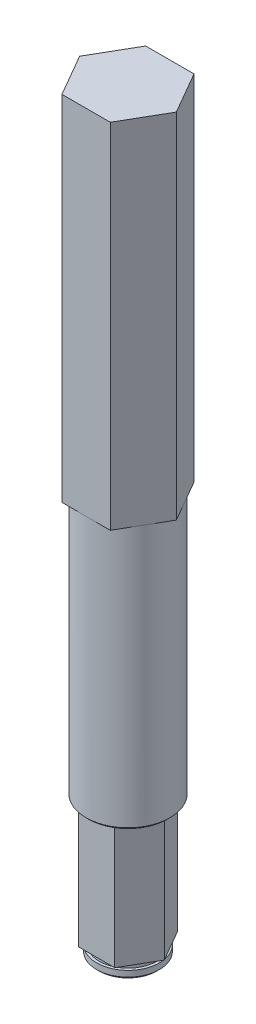
ISO-10303-21;
HEADER;
FILE_DESCRIPTION(('STEP AP214'),'2;1');
FILE_NAME('part.step','',(''),(''),'','','');
FILE_SCHEMA(('AUTOMOTIVE_DESIGN { 1 0 10303 214 1 1 1 1 }'));
ENDSEC;
DATA;
#1=APPLICATION_CONTEXT('core data for automotive mechanical design processes');
#2=APPLICATION_PROTOCOL_DEFINITION('international standard','automotive_design',2000,#1);
#3=PRODUCT_CONTEXT('',#1,'mechanical');
#4=PRODUCT('Part','Part','',(#3));
#5=PRODUCT_RELATED_PRODUCT_CATEGORY('part','',(#4));
#6=PRODUCT_DEFINITION_FORMATION('','',#4);
#7=PRODUCT_DEFINITION_CONTEXT('part definition',#1,'design');
#8=PRODUCT_DEFINITION('design','',#6,#7);
#9=PRODUCT_DEFINITION_SHAPE('','',#8);
#10=(LENGTH_UNIT() NAMED_UNIT(*) SI_UNIT(.MILLI.,.METRE.));
#11=(NAMED_UNIT(*) PLANE_ANGLE_UNIT() SI_UNIT($,.RADIAN.));
#12=(NAMED_UNIT(*) SI_UNIT($,.STERADIAN.) SOLID_ANGLE_UNIT());
#13=UNCERTAINTY_MEASURE_WITH_UNIT(LENGTH_MEASURE(1.E-05),#10,'distance_accuracy_value','');
#14=(GEOMETRIC_REPRESENTATION_CONTEXT(3) GLOBAL_UNCERTAINTY_ASSIGNED_CONTEXT((#13)) GLOBAL_UNIT_ASSIGNED_CONTEXT((#10,
#11,#12)) REPRESENTATION_CONTEXT('',''));
#15=CARTESIAN_POINT('',(0.,0.,0.));
#16=DIRECTION('',(0.,0.,1.));
#17=DIRECTION('',(1.,0.,0.));
#18=AXIS2_PLACEMENT_3D('',#15,#16,#17);
#19=CARTESIAN_POINT('',(0.,-0.6096,0.));
#20=DIRECTION('',(0.,-1.,0.));
#21=DIRECTION('',(1.,0.,0.));
#22=AXIS2_PLACEMENT_3D('',#19,#20,#21);
#23=PLANE('',#22);
#24=CARTESIAN_POINT('',(0.,-0.609600000018416,0.));
#25=DIRECTION('',(0.,1.,0.));
#26=DIRECTION('',(-1.,0.,0.));
#27=AXIS2_PLACEMENT_3D('',#24,#25,#26);
#28=CIRCLE('',#27,4.38149999990856);
#29=CARTESIAN_POINT('',(-4.38149999990856,-0.609600000018418,0.));
#30=VERTEX_POINT('',#29);
#31=EDGE_CURVE('E20',#30,#30,#28,.T.);
#32=ORIENTED_EDGE('',*,*,#31,.F.);
#33=EDGE_LOOP('',(#32));
#34=FACE_BOUND('',#33,.T.);
#35=ADVANCED_FACE('F17',(#34),#23,.T.);
#36=CARTESIAN_POINT('',(0.,-0.228600000014011,0.));
#37=DIRECTION('',(0.,1.,0.));
#38=DIRECTION('',(-1.,0.,0.));
#39=AXIS2_PLACEMENT_3D('',#36,#37,#38);
#40=CONICAL_SURFACE('',#39,4.76249999991296,0.785398163397448);
#41=ORIENTED_EDGE('',*,*,#31,.T.);
#42=EDGE_LOOP('',(#41));
#43=FACE_BOUND('',#42,.T.);
#44=CARTESIAN_POINT('',(0.,-0.228600000000001,0.));
#45=DIRECTION('',(0.,1.,0.));
#46=DIRECTION('',(-1.,0.,0.));
#47=AXIS2_PLACEMENT_3D('',#44,#45,#46);
#48=CIRCLE('',#47,4.7625);
#49=CARTESIAN_POINT('',(-4.7625,-0.228600000000002,0.));
#50=VERTEX_POINT('',#49);
#51=EDGE_CURVE('E185',#50,#50,#48,.T.);
#52=ORIENTED_EDGE('',*,*,#51,.F.);
#53=EDGE_LOOP('',(#52));
#54=FACE_BOUND('',#53,.T.);
#55=ADVANCED_FACE('F232',(#43,#54),#40,.T.);
#56=CARTESIAN_POINT('',(0.,0.,0.));
#57=DIRECTION('',(0.,1.,0.));
#58=DIRECTION('',(-1.,0.,0.));
#59=AXIS2_PLACEMENT_3D('',#56,#57,#58);
#60=CYLINDRICAL_SURFACE('',#59,4.7625);
#61=ORIENTED_EDGE('',*,*,#51,.T.);
#62=EDGE_LOOP('',(#61));
#63=FACE_BOUND('',#62,.T.);
#64=CARTESIAN_POINT('',(0.,0.660400000000001,0.));
#65=DIRECTION('',(0.,1.,0.));
#66=DIRECTION('',(-1.,0.,0.));
#67=AXIS2_PLACEMENT_3D('',#64,#65,#66);
#68=CIRCLE('',#67,4.7625);
#69=CARTESIAN_POINT('',(-4.7625,0.6604,0.));
#70=VERTEX_POINT('',#69);
#71=EDGE_CURVE('E188',#70,#70,#68,.F.);
#72=ORIENTED_EDGE('',*,*,#71,.T.);
#73=EDGE_LOOP('',(#72));
#74=FACE_BOUND('',#73,.T.);
#75=ADVANCED_FACE('F218',(#63,#74),#60,.T.);
#76=CARTESIAN_POINT('',(0.,0.6604,5.29754654056465));
#77=DIRECTION('',(0.,-1.,0.));
#78=DIRECTION('',(0.,0.,-1.));
#79=AXIS2_PLACEMENT_3D('',#76,#77,#78);
#80=PLANE('',#79);
#81=CARTESIAN_POINT('',(0.,0.6604,0.));
#82=DIRECTION('',(0.,1.,0.));
#83=DIRECTION('',(0.,0.,1.));
#84=AXIS2_PLACEMENT_3D('',#81,#82,#83);
#85=CIRCLE('',#84,4.3561);
#86=CARTESIAN_POINT('',(0.,0.6604,4.3561));
#87=VERTEX_POINT('',#86);
#88=EDGE_CURVE('E213',#87,#87,#85,.T.);
#89=ORIENTED_EDGE('',*,*,#88,.F.);
#90=EDGE_LOOP('',(#89));
#91=FACE_BOUND('',#90,.T.);
#92=ORIENTED_EDGE('',*,*,#71,.F.);
#93=EDGE_LOOP('',(#92));
#94=FACE_BOUND('',#93,.T.);
#95=ADVANCED_FACE('F220',(#91,#94),#80,.F.);
#96=CARTESIAN_POINT('',(0.,1.0287,0.));
#97=DIRECTION('',(0.,1.,0.));
#98=DIRECTION('',(0.,0.,1.));
#99=AXIS2_PLACEMENT_3D('',#96,#97,#98);
#100=CYLINDRICAL_SURFACE('',#99,4.3561);
#101=CARTESIAN_POINT('',(0.,1.397,0.));
#102=DIRECTION('',(0.,1.,0.));
#103=DIRECTION('',(0.,0.,1.));
#104=AXIS2_PLACEMENT_3D('',#101,#102,#103);
#105=CIRCLE('',#104,4.3561);
#106=CARTESIAN_POINT('',(0.,1.397,4.3561));
#107=VERTEX_POINT('',#106);
#108=EDGE_CURVE('E141',#107,#107,#105,.F.);
#109=ORIENTED_EDGE('',*,*,#108,.T.);
#110=EDGE_LOOP('',(#109));
#111=FACE_BOUND('',#110,.T.);
#112=ORIENTED_EDGE('',*,*,#88,.T.);
#113=EDGE_LOOP('',(#112));
#114=FACE_BOUND('',#113,.T.);
#115=ADVANCED_FACE('F222',(#111,#114),#100,.T.);
#116=CARTESIAN_POINT('',(0.,1.397,5.29754654056465));
#117=DIRECTION('',(0.,1.,0.));
#118=DIRECTION('',(0.,0.,1.));
#119=AXIS2_PLACEMENT_3D('',#116,#117,#118);
#120=PLANE('',#119);
#121=ORIENTED_EDGE('',*,*,#108,.F.);
#122=EDGE_LOOP('',(#121));
#123=FACE_BOUND('',#122,.T.);
#124=DIRECTION('',(-1.,0.,0.));
#125=VECTOR('',#124,1.);
#126=CARTESIAN_POINT('',(-2.7496306570156,1.397,-4.7625));
#127=LINE('',#126,#125);
#128=CARTESIAN_POINT('',(2.7496306570156,1.397,-4.7625));
#129=VERTEX_POINT('',#128);
#130=CARTESIAN_POINT('',(-2.7496306570156,1.397,-4.7625));
#131=VERTEX_POINT('',#130);
#132=EDGE_CURVE('E537',#129,#131,#127,.T.);
#133=ORIENTED_EDGE('',*,*,#132,.F.);
#134=DIRECTION('',(-0.5,0.,-0.866025403784439));
#135=VECTOR('',#134,1.);
#136=CARTESIAN_POINT('',(2.7496306570156,1.397,-4.7625));
#137=LINE('',#136,#135);
#138=CARTESIAN_POINT('',(5.49926131403119,1.397,0.));
#139=VERTEX_POINT('',#138);
#140=EDGE_CURVE('E543',#139,#129,#137,.T.);
#141=ORIENTED_EDGE('',*,*,#140,.F.);
#142=DIRECTION('',(0.5,0.,-0.866025403784439));
#143=VECTOR('',#142,1.);
#144=CARTESIAN_POINT('',(5.49926131403119,1.397,0.));
#145=LINE('',#144,#143);
#146=CARTESIAN_POINT('',(2.7496306570156,1.397,4.7625));
#147=VERTEX_POINT('',#146);
#148=EDGE_CURVE('E125',#147,#139,#145,.T.);
#149=ORIENTED_EDGE('',*,*,#148,.F.);
#150=DIRECTION('',(1.,0.,0.));
#151=VECTOR('',#150,1.);
#152=CARTESIAN_POINT('',(0.,1.397,4.7625));
#153=LINE('',#152,#151);
#154=CARTESIAN_POINT('',(-2.7496306570156,1.397,4.7625));
#155=VERTEX_POINT('',#154);
#156=EDGE_CURVE('E122',#155,#147,#153,.T.);
#157=ORIENTED_EDGE('',*,*,#156,.F.);
#158=DIRECTION('',(0.499999999999999,0.,0.866025403784439));
#159=VECTOR('',#158,1.);
#160=CARTESIAN_POINT('',(-2.7496306570156,1.397,4.7625));
#161=LINE('',#160,#159);
#162=CARTESIAN_POINT('',(-5.49926131403119,1.397,0.));
#163=VERTEX_POINT('',#162);
#164=EDGE_CURVE('E107',#163,#155,#161,.T.);
#165=ORIENTED_EDGE('',*,*,#164,.F.);
#166=DIRECTION('',(-0.5,0.,0.866025403784438));
#167=VECTOR('',#166,1.);
#168=CARTESIAN_POINT('',(-5.49926131403119,1.397,0.));
#169=LINE('',#168,#167);
#170=EDGE_CURVE('E532',#131,#163,#169,.T.);
#171=ORIENTED_EDGE('',*,*,#170,.F.);
#172=EDGE_LOOP('',(#133,#141,#149,#157,#165,#171));
#173=FACE_BOUND('',#172,.T.);
#174=ADVANCED_FACE('F123',(#123,#173),#120,.F.);
#175=CARTESIAN_POINT('',(0.,113.6904,0.));
#176=DIRECTION('',(0.,-1.,0.));
#177=DIRECTION('',(1.,0.,0.));
#178=AXIS2_PLACEMENT_3D('',#175,#176,#177);
#179=PLANE('',#178);
#180=DIRECTION('',(-0.5,0.,0.866025403784439));
#181=VECTOR('',#180,1.);
#182=CARTESIAN_POINT('',(-3.66617420935416,113.6904,-6.35));
#183=LINE('',#182,#181);
#184=CARTESIAN_POINT('',(-7.33234841870828,113.6904,0.));
#185=VERTEX_POINT('',#184);
#186=CARTESIAN_POINT('',(-3.66617420935414,113.6904,-6.35));
#187=VERTEX_POINT('',#186);
#188=EDGE_CURVE('E152',#185,#187,#183,.F.);
#189=ORIENTED_EDGE('',*,*,#188,.F.);
#190=DIRECTION('',(0.5,0.,0.866025403784438));
#191=VECTOR('',#190,1.);
#192=CARTESIAN_POINT('',(-7.33234841870827,113.6904,0.));
#193=LINE('',#192,#191);
#194=CARTESIAN_POINT('',(-3.66617420935415,113.6904,6.35));
#195=VERTEX_POINT('',#194);
#196=EDGE_CURVE('E176',#195,#185,#193,.F.);
#197=ORIENTED_EDGE('',*,*,#196,.F.);
#198=DIRECTION('',(1.,0.,0.));
#199=VECTOR('',#198,1.);
#200=CARTESIAN_POINT('',(-3.66617420935416,113.6904,6.35));
#201=LINE('',#200,#199);
#202=CARTESIAN_POINT('',(3.6661742093541,113.6904,6.35));
#203=VERTEX_POINT('',#202);
#204=EDGE_CURVE('E98',#203,#195,#201,.F.);
#205=ORIENTED_EDGE('',*,*,#204,.F.);
#206=DIRECTION('',(0.5,0.,-0.866025403784439));
#207=VECTOR('',#206,1.);
#208=CARTESIAN_POINT('',(3.66617420935409,113.6904,6.35));
#209=LINE('',#208,#207);
#210=CARTESIAN_POINT('',(7.33234841870822,113.6904,0.));
#211=VERTEX_POINT('',#210);
#212=EDGE_CURVE('E171',#211,#203,#209,.F.);
#213=ORIENTED_EDGE('',*,*,#212,.F.);
#214=DIRECTION('',(-0.500000000000001,0.,-0.866025403784438));
#215=VECTOR('',#214,1.);
#216=CARTESIAN_POINT('',(7.33234841870822,113.6904,0.));
#217=LINE('',#216,#215);
#218=CARTESIAN_POINT('',(3.66617420935409,113.6904,-6.35));
#219=VERTEX_POINT('',#218);
#220=EDGE_CURVE('E166',#219,#211,#217,.F.);
#221=ORIENTED_EDGE('',*,*,#220,.F.);
#222=DIRECTION('',(-1.,0.,0.));
#223=VECTOR('',#222,1.);
#224=CARTESIAN_POINT('',(3.66617420935409,113.6904,-6.35));
#225=LINE('',#224,#223);
#226=EDGE_CURVE('E159',#187,#219,#225,.F.);
#227=ORIENTED_EDGE('',*,*,#226,.F.);
#228=EDGE_LOOP('',(#189,#197,#205,#213,#221,#227));
#229=FACE_BOUND('',#228,.T.);
#230=ADVANCED_FACE('F318',(#229),#179,.F.);
#231=CARTESIAN_POINT('',(-2.7496306570156,0.,4.7625));
#232=DIRECTION('',(-0.866025403784439,0.,0.499999999999999));
#233=DIRECTION('',(0.499999999999999,0.,0.866025403784439));
#234=AXIS2_PLACEMENT_3D('',#231,#232,#233);
#235=PLANE('',#234);
#236=DIRECTION('',(0.5,0.,0.866025403784438));
#237=VECTOR('',#236,1.);
#238=CARTESIAN_POINT('',(-5.49926131403119,20.1296905,0.));
#239=LINE('',#238,#237);
#240=CARTESIAN_POINT('',(-5.49926131403119,20.1296905,0.));
#241=VERTEX_POINT('',#240);
#242=CARTESIAN_POINT('',(-2.7496306570156,20.1296905,4.7625));
#243=VERTEX_POINT('',#242);
#244=EDGE_CURVE('E556',#241,#243,#239,.T.);
#245=ORIENTED_EDGE('',*,*,#244,.F.);
#246=DIRECTION('',(0.,1.,0.));
#247=VECTOR('',#246,1.);
#248=CARTESIAN_POINT('',(-5.49926131403119,0.,0.));
#249=LINE('',#248,#247);
#250=EDGE_CURVE('E139',#163,#241,#249,.T.);
#251=ORIENTED_EDGE('',*,*,#250,.F.);
#252=ORIENTED_EDGE('',*,*,#164,.T.);
#253=DIRECTION('',(0.,1.,0.));
#254=VECTOR('',#253,1.);
#255=CARTESIAN_POINT('',(-2.7496306570156,0.,4.7625));
#256=LINE('',#255,#254);
#257=EDGE_CURVE('E130',#243,#155,#256,.F.);
#258=ORIENTED_EDGE('',*,*,#257,.F.);
#259=EDGE_LOOP('',(#245,#251,#252,#258));
#260=FACE_BOUND('',#259,.T.);
#261=ADVANCED_FACE('F135',(#260),#235,.T.);
#262=CARTESIAN_POINT('',(0.,0.,4.7625));
#263=DIRECTION('',(0.,0.,1.));
#264=DIRECTION('',(1.,0.,0.));
#265=AXIS2_PLACEMENT_3D('',#262,#263,#264);
#266=PLANE('',#265);
#267=DIRECTION('',(1.,0.,0.));
#268=VECTOR('',#267,1.);
#269=CARTESIAN_POINT('',(5.55625,20.1296905,4.7625));
#270=LINE('',#269,#268);
#271=CARTESIAN_POINT('',(2.7496306570156,20.1296905,4.7625));
#272=VERTEX_POINT('',#271);
#273=EDGE_CURVE('E145',#243,#272,#270,.T.);
#274=ORIENTED_EDGE('',*,*,#273,.F.);
#275=ORIENTED_EDGE('',*,*,#257,.T.);
#276=ORIENTED_EDGE('',*,*,#156,.T.);
#277=DIRECTION('',(0.,1.,0.));
#278=VECTOR('',#277,1.);
#279=CARTESIAN_POINT('',(2.7496306570156,0.,4.7625));
#280=LINE('',#279,#278);
#281=EDGE_CURVE('E148',#272,#147,#280,.F.);
#282=ORIENTED_EDGE('',*,*,#281,.F.);
#283=EDGE_LOOP('',(#274,#275,#276,#282));
#284=FACE_BOUND('',#283,.T.);
#285=ADVANCED_FACE('F143',(#284),#266,.T.);
#286=CARTESIAN_POINT('',(5.49926131403119,0.,0.));
#287=DIRECTION('',(0.866025403784439,0.,0.5));
#288=DIRECTION('',(0.5,0.,-0.866025403784439));
#289=AXIS2_PLACEMENT_3D('',#286,#287,#288);
#290=PLANE('',#289);
#291=DIRECTION('',(0.499999999999997,0.,-0.86602540378444));
#292=VECTOR('',#291,1.);
#293=CARTESIAN_POINT('',(2.7496306570156,20.1296905,4.7625));
#294=LINE('',#293,#292);
#295=CARTESIAN_POINT('',(5.49926131403118,20.1296905,0.));
#296=VERTEX_POINT('',#295);
#297=EDGE_CURVE('E549',#272,#296,#294,.T.);
#298=ORIENTED_EDGE('',*,*,#297,.F.);
#299=ORIENTED_EDGE('',*,*,#281,.T.);
#300=ORIENTED_EDGE('',*,*,#148,.T.);
#301=DIRECTION('',(0.,1.,0.));
#302=VECTOR('',#301,1.);
#303=CARTESIAN_POINT('',(5.49926131403118,0.,0.));
#304=LINE('',#303,#302);
#305=EDGE_CURVE('E540',#296,#139,#304,.F.);
#306=ORIENTED_EDGE('',*,*,#305,.F.);
#307=EDGE_LOOP('',(#298,#299,#300,#306));
#308=FACE_BOUND('',#307,.T.);
#309=ADVANCED_FACE('F309',(#308),#290,.T.);
#310=CARTESIAN_POINT('',(2.7496306570156,0.,-4.7625));
#311=DIRECTION('',(0.866025403784439,0.,-0.5));
#312=DIRECTION('',(-0.5,0.,-0.866025403784439));
#313=AXIS2_PLACEMENT_3D('',#310,#311,#312);
#314=PLANE('',#313);
#315=DIRECTION('',(-0.499999999999997,0.,-0.86602540378444));
#316=VECTOR('',#315,1.);
#317=CARTESIAN_POINT('',(5.49926131403117,20.1296905,0.));
#318=LINE('',#317,#316);
#319=CARTESIAN_POINT('',(2.7496306570156,20.1296905,-4.7625));
#320=VERTEX_POINT('',#319);
#321=EDGE_CURVE('E570',#296,#320,#318,.T.);
#322=ORIENTED_EDGE('',*,*,#321,.F.);
#323=ORIENTED_EDGE('',*,*,#305,.T.);
#324=ORIENTED_EDGE('',*,*,#140,.T.);
#325=DIRECTION('',(0.,1.,0.));
#326=VECTOR('',#325,1.);
#327=CARTESIAN_POINT('',(2.7496306570156,0.,-4.7625));
#328=LINE('',#327,#326);
#329=EDGE_CURVE('E534',#320,#129,#328,.F.);
#330=ORIENTED_EDGE('',*,*,#329,.F.);
#331=EDGE_LOOP('',(#322,#323,#324,#330));
#332=FACE_BOUND('',#331,.T.);
#333=ADVANCED_FACE('F305',(#332),#314,.T.);
#334=CARTESIAN_POINT('',(-2.7496306570156,0.,-4.7625));
#335=DIRECTION('',(0.,0.,-1.));
#336=DIRECTION('',(-1.,0.,0.));
#337=AXIS2_PLACEMENT_3D('',#334,#335,#336);
#338=PLANE('',#337);
#339=DIRECTION('',(1.,0.,0.));
#340=VECTOR('',#339,1.);
#341=CARTESIAN_POINT('',(5.55625,20.1296905,-4.7625));
#342=LINE('',#341,#340);
#343=CARTESIAN_POINT('',(-2.7496306570156,20.1296905,-4.7625));
#344=VERTEX_POINT('',#343);
#345=EDGE_CURVE('E566',#320,#344,#342,.F.);
#346=ORIENTED_EDGE('',*,*,#345,.F.);
#347=ORIENTED_EDGE('',*,*,#329,.T.);
#348=ORIENTED_EDGE('',*,*,#132,.T.);
#349=DIRECTION('',(0.,1.,0.));
#350=VECTOR('',#349,1.);
#351=CARTESIAN_POINT('',(-2.7496306570156,0.,-4.7625));
#352=LINE('',#351,#350);
#353=EDGE_CURVE('E173',#344,#131,#352,.F.);
#354=ORIENTED_EDGE('',*,*,#353,.F.);
#355=EDGE_LOOP('',(#346,#347,#348,#354));
#356=FACE_BOUND('',#355,.T.);
#357=ADVANCED_FACE('F301',(#356),#338,.T.);
#358=CARTESIAN_POINT('',(-5.49926131403119,0.,0.));
#359=DIRECTION('',(-0.866025403784438,0.,-0.5));
#360=DIRECTION('',(-0.5,0.,0.866025403784438));
#361=AXIS2_PLACEMENT_3D('',#358,#359,#360);
#362=PLANE('',#361);
#363=DIRECTION('',(-0.500000000000001,0.,0.866025403784438));
#364=VECTOR('',#363,1.);
#365=CARTESIAN_POINT('',(-2.7496306570156,20.1296905,-4.7625));
#366=LINE('',#365,#364);
#367=EDGE_CURVE('E562',#344,#241,#366,.T.);
#368=ORIENTED_EDGE('',*,*,#367,.F.);
#369=ORIENTED_EDGE('',*,*,#353,.T.);
#370=ORIENTED_EDGE('',*,*,#170,.T.);
#371=ORIENTED_EDGE('',*,*,#250,.T.);
#372=EDGE_LOOP('',(#368,#369,#370,#371));
#373=FACE_BOUND('',#372,.T.);
#374=ADVANCED_FACE('F297',(#373),#362,.T.);
#375=CARTESIAN_POINT('',(3.66617420935409,114.3,6.35));
#376=DIRECTION('',(0.866025403784439,0.,0.5));
#377=DIRECTION('',(0.5,0.,-0.866025403784439));
#378=AXIS2_PLACEMENT_3D('',#375,#376,#377);
#379=PLANE('',#378);
#380=DIRECTION('',(0.499999999999998,0.,-0.86602540378444));
#381=VECTOR('',#380,1.);
#382=CARTESIAN_POINT('',(5.49926131403117,60.0964,3.175));
#383=LINE('',#382,#381);
#384=CARTESIAN_POINT('',(5.49926131403117,60.0964,3.17499999999999));
#385=VERTEX_POINT('',#384);
#386=CARTESIAN_POINT('',(7.33234841870823,60.0964,0.));
#387=VERTEX_POINT('',#386);
#388=EDGE_CURVE('E567',#385,#387,#383,.T.);
#389=ORIENTED_EDGE('',*,*,#388,.T.);
#390=DIRECTION('',(0.,1.,0.));
#391=VECTOR('',#390,1.);
#392=CARTESIAN_POINT('',(7.33234841870822,114.3,0.));
#393=LINE('',#392,#391);
#394=EDGE_CURVE('E163',#211,#387,#393,.F.);
#395=ORIENTED_EDGE('',*,*,#394,.F.);
#396=ORIENTED_EDGE('',*,*,#212,.T.);
#397=DIRECTION('',(0.,1.,0.));
#398=VECTOR('',#397,1.);
#399=CARTESIAN_POINT('',(3.66617420935411,114.3,6.35));
#400=LINE('',#399,#398);
#401=CARTESIAN_POINT('',(3.66617420935411,60.0964,6.35));
#402=VERTEX_POINT('',#401);
#403=EDGE_CURVE('E179',#402,#203,#400,.T.);
#404=ORIENTED_EDGE('',*,*,#403,.F.);
#405=DIRECTION('',(0.499999999999999,0.,-0.866025403784439));
#406=VECTOR('',#405,1.);
#407=CARTESIAN_POINT('',(3.66617420935411,60.0964,6.35));
#408=LINE('',#407,#406);
#409=EDGE_CURVE('E595',#402,#385,#408,.T.);
#410=ORIENTED_EDGE('',*,*,#409,.T.);
#411=EDGE_LOOP('',(#389,#395,#396,#404,#410));
#412=FACE_BOUND('',#411,.T.);
#413=ADVANCED_FACE('F293',(#412),#379,.T.);
#414=CARTESIAN_POINT('',(-3.66617420935416,114.3,6.35));
#415=DIRECTION('',(0.,0.,1.));
#416=DIRECTION('',(1.,0.,0.));
#417=AXIS2_PLACEMENT_3D('',#414,#415,#416);
#418=PLANE('',#417);
#419=DIRECTION('',(-1.,0.,0.));
#420=VECTOR('',#419,1.);
#421=CARTESIAN_POINT('',(0.,60.0964,6.35));
#422=LINE('',#421,#420);
#423=CARTESIAN_POINT('',(0.,60.0964,6.35));
#424=VERTEX_POINT('',#423);
#425=EDGE_CURVE('E598',#424,#402,#422,.F.);
#426=ORIENTED_EDGE('',*,*,#425,.T.);
#427=ORIENTED_EDGE('',*,*,#403,.T.);
#428=ORIENTED_EDGE('',*,*,#204,.T.);
#429=DIRECTION('',(0.,1.,0.));
#430=VECTOR('',#429,1.);
#431=CARTESIAN_POINT('',(-3.66617420935415,114.3,6.35000000000001));
#432=LINE('',#431,#430);
#433=CARTESIAN_POINT('',(-3.66617420935414,60.0964,6.35));
#434=VERTEX_POINT('',#433);
#435=EDGE_CURVE('E156',#434,#195,#432,.T.);
#436=ORIENTED_EDGE('',*,*,#435,.F.);
#437=DIRECTION('',(-1.,0.,0.));
#438=VECTOR('',#437,1.);
#439=CARTESIAN_POINT('',(0.,60.0964,6.35));
#440=LINE('',#439,#438);
#441=EDGE_CURVE('E587',#434,#424,#440,.F.);
#442=ORIENTED_EDGE('',*,*,#441,.T.);
#443=EDGE_LOOP('',(#426,#427,#428,#436,#442));
#444=FACE_BOUND('',#443,.T.);
#445=ADVANCED_FACE('F289',(#444),#418,.T.);
#446=CARTESIAN_POINT('',(-7.33234841870827,114.3,0.));
#447=DIRECTION('',(-0.866025403784438,0.,0.5));
#448=DIRECTION('',(0.5,0.,0.866025403784438));
#449=AXIS2_PLACEMENT_3D('',#446,#447,#448);
#450=PLANE('',#449);
#451=DIRECTION('',(0.499999999999999,0.,0.866025403784439));
#452=VECTOR('',#451,1.);
#453=CARTESIAN_POINT('',(-5.49926131403119,60.0964,3.175));
#454=LINE('',#453,#452);
#455=CARTESIAN_POINT('',(-5.49926131403119,60.0964,3.17500000000001));
#456=VERTEX_POINT('',#455);
#457=EDGE_CURVE('E594',#456,#434,#454,.T.);
#458=ORIENTED_EDGE('',*,*,#457,.T.);
#459=ORIENTED_EDGE('',*,*,#435,.T.);
#460=ORIENTED_EDGE('',*,*,#196,.T.);
#461=DIRECTION('',(0.,1.,0.));
#462=VECTOR('',#461,1.);
#463=CARTESIAN_POINT('',(-7.33234841870828,114.3,0.));
#464=LINE('',#463,#462);
#465=CARTESIAN_POINT('',(-7.33234841870827,60.0964,0.));
#466=VERTEX_POINT('',#465);
#467=EDGE_CURVE('E155',#466,#185,#464,.T.);
#468=ORIENTED_EDGE('',*,*,#467,.F.);
#469=DIRECTION('',(0.500000000000004,0.,0.866025403784436));
#470=VECTOR('',#469,1.);
#471=CARTESIAN_POINT('',(-7.33234841870827,60.0964,0.));
#472=LINE('',#471,#470);
#473=EDGE_CURVE('E586',#466,#456,#472,.T.);
#474=ORIENTED_EDGE('',*,*,#473,.T.);
#475=EDGE_LOOP('',(#458,#459,#460,#468,#474));
#476=FACE_BOUND('',#475,.T.);
#477=ADVANCED_FACE('F285',(#476),#450,.T.);
#478=CARTESIAN_POINT('',(-3.66617420935416,114.3,-6.35));
#479=DIRECTION('',(-0.866025403784439,0.,-0.5));
#480=DIRECTION('',(-0.5,0.,0.866025403784439));
#481=AXIS2_PLACEMENT_3D('',#478,#479,#480);
#482=PLANE('',#481);
#483=DIRECTION('',(-0.499999999999998,0.,0.86602540378444));
#484=VECTOR('',#483,1.);
#485=CARTESIAN_POINT('',(-5.49926131403122,60.0964,-3.175));
#486=LINE('',#485,#484);
#487=CARTESIAN_POINT('',(-5.49926131403121,60.0964,-3.17500000000001));
#488=VERTEX_POINT('',#487);
#489=EDGE_CURVE('E510',#488,#466,#486,.T.);
#490=ORIENTED_EDGE('',*,*,#489,.T.);
#491=ORIENTED_EDGE('',*,*,#467,.T.);
#492=ORIENTED_EDGE('',*,*,#188,.T.);
#493=DIRECTION('',(0.,1.,0.));
#494=VECTOR('',#493,1.);
#495=CARTESIAN_POINT('',(-3.66617420935414,114.3,-6.35));
#496=LINE('',#495,#494);
#497=CARTESIAN_POINT('',(-3.66617420935414,60.0964,-6.35));
#498=VERTEX_POINT('',#497);
#499=EDGE_CURVE('E559',#498,#187,#496,.T.);
#500=ORIENTED_EDGE('',*,*,#499,.F.);
#501=DIRECTION('',(-0.500000000000004,0.,0.866025403784436));
#502=VECTOR('',#501,1.);
#503=CARTESIAN_POINT('',(-3.66617420935414,60.0964,-6.35));
#504=LINE('',#503,#502);
#505=EDGE_CURVE('E582',#498,#488,#504,.T.);
#506=ORIENTED_EDGE('',*,*,#505,.T.);
#507=EDGE_LOOP('',(#490,#491,#492,#500,#506));
#508=FACE_BOUND('',#507,.T.);
#509=ADVANCED_FACE('F282',(#508),#482,.T.);
#510=CARTESIAN_POINT('',(7.33234841870822,114.3,0.));
#511=DIRECTION('',(0.866025403784438,0.,-0.500000000000001));
#512=DIRECTION('',(-0.500000000000001,0.,-0.866025403784438));
#513=AXIS2_PLACEMENT_3D('',#510,#511,#512);
#514=PLANE('',#513);
#515=DIRECTION('',(-0.500000000000004,0.,-0.866025403784436));
#516=VECTOR('',#515,1.);
#517=CARTESIAN_POINT('',(5.49926131403117,60.0964,-3.175));
#518=LINE('',#517,#516);
#519=CARTESIAN_POINT('',(5.49926131403116,60.0964,-3.17500000000001));
#520=VERTEX_POINT('',#519);
#521=CARTESIAN_POINT('',(3.66617420935409,60.0964,-6.35));
#522=VERTEX_POINT('',#521);
#523=EDGE_CURVE('E62',#520,#522,#518,.T.);
#524=ORIENTED_EDGE('',*,*,#523,.T.);
#525=DIRECTION('',(0.,1.,0.));
#526=VECTOR('',#525,1.);
#527=CARTESIAN_POINT('',(3.66617420935409,114.3,-6.35));
#528=LINE('',#527,#526);
#529=EDGE_CURVE('E162',#219,#522,#528,.F.);
#530=ORIENTED_EDGE('',*,*,#529,.F.);
#531=ORIENTED_EDGE('',*,*,#220,.T.);
#532=ORIENTED_EDGE('',*,*,#394,.T.);
#533=DIRECTION('',(-0.499999999999999,0.,-0.866025403784439));
#534=VECTOR('',#533,1.);
#535=CARTESIAN_POINT('',(7.33234841870822,60.0964,0.));
#536=LINE('',#535,#534);
#537=EDGE_CURVE('E55',#387,#520,#536,.T.);
#538=ORIENTED_EDGE('',*,*,#537,.T.);
#539=EDGE_LOOP('',(#524,#530,#531,#532,#538));
#540=FACE_BOUND('',#539,.T.);
#541=ADVANCED_FACE('F279',(#540),#514,.T.);
#542=CARTESIAN_POINT('',(3.66617420935409,114.3,-6.35));
#543=DIRECTION('',(0.,0.,-1.));
#544=DIRECTION('',(-1.,0.,0.));
#545=AXIS2_PLACEMENT_3D('',#542,#543,#544);
#546=PLANE('',#545);
#547=DIRECTION('',(-1.,0.,0.));
#548=VECTOR('',#547,1.);
#549=CARTESIAN_POINT('',(0.,60.0964,-6.35));
#550=LINE('',#549,#548);
#551=CARTESIAN_POINT('',(0.,60.0964,-6.35));
#552=VERTEX_POINT('',#551);
#553=EDGE_CURVE('E580',#552,#498,#550,.T.);
#554=ORIENTED_EDGE('',*,*,#553,.T.);
#555=ORIENTED_EDGE('',*,*,#499,.T.);
#556=ORIENTED_EDGE('',*,*,#226,.T.);
#557=ORIENTED_EDGE('',*,*,#529,.T.);
#558=DIRECTION('',(-1.,0.,0.));
#559=VECTOR('',#558,1.);
#560=CARTESIAN_POINT('',(0.,60.0964,-6.35));
#561=LINE('',#560,#559);
#562=EDGE_CURVE('E35',#522,#552,#561,.T.);
#563=ORIENTED_EDGE('',*,*,#562,.T.);
#564=EDGE_LOOP('',(#554,#555,#556,#557,#563));
#565=FACE_BOUND('',#564,.T.);
#566=ADVANCED_FACE('F275',(#565),#546,.T.);
#567=CARTESIAN_POINT('',(5.55625,20.1296905,0.));
#568=DIRECTION('',(0.,-1.,0.));
#569=DIRECTION('',(1.,0.,0.));
#570=AXIS2_PLACEMENT_3D('',#567,#568,#569);
#571=PLANE('',#570);
#572=CARTESIAN_POINT('',(0.,20.1296905000277,0.));
#573=DIRECTION('',(0.,1.,0.));
#574=DIRECTION('',(-1.,0.,0.));
#575=AXIS2_PLACEMENT_3D('',#572,#573,#574);
#576=CIRCLE('',#575,5.96900000005007);
#577=CARTESIAN_POINT('',(-5.96900000005007,20.1296905000277,0.));
#578=VERTEX_POINT('',#577);
#579=EDGE_CURVE('E208',#578,#578,#576,.T.);
#580=ORIENTED_EDGE('',*,*,#579,.F.);
#581=EDGE_LOOP('',(#580));
#582=FACE_BOUND('',#581,.T.);
#583=ORIENTED_EDGE('',*,*,#345,.T.);
#584=ORIENTED_EDGE('',*,*,#367,.T.);
#585=ORIENTED_EDGE('',*,*,#244,.T.);
#586=ORIENTED_EDGE('',*,*,#273,.T.);
#587=ORIENTED_EDGE('',*,*,#297,.T.);
#588=ORIENTED_EDGE('',*,*,#321,.T.);
#589=EDGE_LOOP('',(#583,#584,#585,#586,#587,#588));
#590=FACE_BOUND('',#589,.T.);
#591=ADVANCED_FACE('F271',(#582,#590),#571,.T.);
#592=CARTESIAN_POINT('',(0.,60.0964,0.));
#593=DIRECTION('',(0.,1.,0.));
#594=DIRECTION('',(-1.,0.,0.));
#595=AXIS2_PLACEMENT_3D('',#592,#593,#594);
#596=PLANE('',#595);
#597=ORIENTED_EDGE('',*,*,#537,.F.);
#598=ORIENTED_EDGE('',*,*,#388,.F.);
#599=CARTESIAN_POINT('',(0.,60.0964,0.));
#600=DIRECTION('',(0.,-1.,0.));
#601=DIRECTION('',(1.,0.,0.));
#602=AXIS2_PLACEMENT_3D('',#599,#600,#601);
#603=CIRCLE('',#602,6.35);
#604=EDGE_CURVE('E205',#520,#385,#603,.T.);
#605=ORIENTED_EDGE('',*,*,#604,.F.);
#606=EDGE_LOOP('',(#597,#598,#605));
#607=FACE_BOUND('',#606,.T.);
#608=ADVANCED_FACE('F267',(#607),#596,.F.);
#609=CARTESIAN_POINT('',(0.,60.0964,0.));
#610=DIRECTION('',(0.,1.,0.));
#611=DIRECTION('',(-1.,0.,0.));
#612=AXIS2_PLACEMENT_3D('',#609,#610,#611);
#613=PLANE('',#612);
#614=ORIENTED_EDGE('',*,*,#409,.F.);
#615=ORIENTED_EDGE('',*,*,#425,.F.);
#616=CARTESIAN_POINT('',(0.,60.0964,0.));
#617=DIRECTION('',(0.,-1.,0.));
#618=DIRECTION('',(1.,0.,0.));
#619=AXIS2_PLACEMENT_3D('',#616,#617,#618);
#620=CIRCLE('',#619,6.35);
#621=EDGE_CURVE('E202',#385,#424,#620,.T.);
#622=ORIENTED_EDGE('',*,*,#621,.F.);
#623=EDGE_LOOP('',(#614,#615,#622));
#624=FACE_BOUND('',#623,.T.);
#625=ADVANCED_FACE('F263',(#624),#613,.F.);
#626=CARTESIAN_POINT('',(0.,60.0964,0.));
#627=DIRECTION('',(0.,1.,0.));
#628=DIRECTION('',(-1.,0.,0.));
#629=AXIS2_PLACEMENT_3D('',#626,#627,#628);
#630=PLANE('',#629);
#631=ORIENTED_EDGE('',*,*,#441,.F.);
#632=ORIENTED_EDGE('',*,*,#457,.F.);
#633=CARTESIAN_POINT('',(0.,60.0964,0.));
#634=DIRECTION('',(0.,-1.,0.));
#635=DIRECTION('',(1.,0.,0.));
#636=AXIS2_PLACEMENT_3D('',#633,#634,#635);
#637=CIRCLE('',#636,6.35);
#638=EDGE_CURVE('E199',#424,#456,#637,.T.);
#639=ORIENTED_EDGE('',*,*,#638,.F.);
#640=EDGE_LOOP('',(#631,#632,#639));
#641=FACE_BOUND('',#640,.T.);
#642=ADVANCED_FACE('F259',(#641),#630,.F.);
#643=CARTESIAN_POINT('',(0.,60.0964,0.));
#644=DIRECTION('',(0.,1.,0.));
#645=DIRECTION('',(-1.,0.,0.));
#646=AXIS2_PLACEMENT_3D('',#643,#644,#645);
#647=PLANE('',#646);
#648=ORIENTED_EDGE('',*,*,#473,.F.);
#649=ORIENTED_EDGE('',*,*,#489,.F.);
#650=CARTESIAN_POINT('',(0.,60.0964,0.));
#651=DIRECTION('',(0.,-1.,0.));
#652=DIRECTION('',(1.,0.,0.));
#653=AXIS2_PLACEMENT_3D('',#650,#651,#652);
#654=CIRCLE('',#653,6.35);
#655=EDGE_CURVE('E196',#456,#488,#654,.T.);
#656=ORIENTED_EDGE('',*,*,#655,.F.);
#657=EDGE_LOOP('',(#648,#649,#656));
#658=FACE_BOUND('',#657,.T.);
#659=ADVANCED_FACE('F255',(#658),#647,.F.);
#660=CARTESIAN_POINT('',(0.,60.0964,0.));
#661=DIRECTION('',(0.,1.,0.));
#662=DIRECTION('',(-1.,0.,0.));
#663=AXIS2_PLACEMENT_3D('',#660,#661,#662);
#664=PLANE('',#663);
#665=ORIENTED_EDGE('',*,*,#505,.F.);
#666=ORIENTED_EDGE('',*,*,#553,.F.);
#667=CARTESIAN_POINT('',(0.,60.0964,0.));
#668=DIRECTION('',(0.,-1.,0.));
#669=DIRECTION('',(1.,0.,0.));
#670=AXIS2_PLACEMENT_3D('',#667,#668,#669);
#671=CIRCLE('',#670,6.35);
#672=EDGE_CURVE('E193',#488,#552,#671,.T.);
#673=ORIENTED_EDGE('',*,*,#672,.F.);
#674=EDGE_LOOP('',(#665,#666,#673));
#675=FACE_BOUND('',#674,.T.);
#676=ADVANCED_FACE('F251',(#675),#664,.F.);
#677=CARTESIAN_POINT('',(0.,60.0964,0.));
#678=DIRECTION('',(0.,1.,0.));
#679=DIRECTION('',(-1.,0.,0.));
#680=AXIS2_PLACEMENT_3D('',#677,#678,#679);
#681=PLANE('',#680);
#682=ORIENTED_EDGE('',*,*,#562,.F.);
#683=ORIENTED_EDGE('',*,*,#523,.F.);
#684=CARTESIAN_POINT('',(0.,60.0964,0.));
#685=DIRECTION('',(0.,-1.,0.));
#686=DIRECTION('',(1.,0.,0.));
#687=AXIS2_PLACEMENT_3D('',#684,#685,#686);
#688=CIRCLE('',#687,6.35);
#689=EDGE_CURVE('E26',#552,#520,#688,.T.);
#690=ORIENTED_EDGE('',*,*,#689,.F.);
#691=EDGE_LOOP('',(#682,#683,#690));
#692=FACE_BOUND('',#691,.T.);
#693=ADVANCED_FACE('F244',(#692),#681,.F.);
#694=CARTESIAN_POINT('',(0.,20.5106904999184,0.));
#695=DIRECTION('',(0.,1.,0.));
#696=DIRECTION('',(-1.,0.,0.));
#697=AXIS2_PLACEMENT_3D('',#694,#695,#696);
#698=CONICAL_SURFACE('',#697,6.34999999994079,0.785398163397448);
#699=ORIENTED_EDGE('',*,*,#579,.T.);
#700=EDGE_LOOP('',(#699));
#701=FACE_BOUND('',#700,.T.);
#702=CARTESIAN_POINT('',(0.,20.5106905,0.));
#703=DIRECTION('',(0.,-1.,0.));
#704=DIRECTION('',(1.,0.,0.));
#705=AXIS2_PLACEMENT_3D('',#702,#703,#704);
#706=CIRCLE('',#705,6.35);
#707=CARTESIAN_POINT('',(6.34999999999999,20.5106905,0.));
#708=VERTEX_POINT('',#707);
#709=EDGE_CURVE('E11',#708,#708,#706,.F.);
#710=ORIENTED_EDGE('',*,*,#709,.F.);
#711=EDGE_LOOP('',(#710));
#712=FACE_BOUND('',#711,.T.);
#713=ADVANCED_FACE('F238',(#701,#712),#698,.T.);
#714=CARTESIAN_POINT('',(0.,48.16484525,0.));
#715=DIRECTION('',(0.,-1.,0.));
#716=DIRECTION('',(1.,0.,0.));
#717=AXIS2_PLACEMENT_3D('',#714,#715,#716);
#718=CYLINDRICAL_SURFACE('',#717,6.35);
#719=ORIENTED_EDGE('',*,*,#709,.T.);
#720=EDGE_LOOP('',(#719));
#721=FACE_BOUND('',#720,.T.);
#722=ORIENTED_EDGE('',*,*,#672,.T.);
#723=ORIENTED_EDGE('',*,*,#689,.T.);
#724=ORIENTED_EDGE('',*,*,#604,.T.);
#725=ORIENTED_EDGE('',*,*,#621,.T.);
#726=ORIENTED_EDGE('',*,*,#638,.T.);
#727=ORIENTED_EDGE('',*,*,#655,.T.);
#728=EDGE_LOOP('',(#722,#723,#724,#725,#726,#727));
#729=FACE_BOUND('',#728,.T.);
#730=ADVANCED_FACE('F236',(#721,#729),#718,.T.);
#731=CLOSED_SHELL('',(#35,#55,#75,#95,#115,#174,#230,#261,#285,#309,#333,#357,#374,#413,#445,
#477,#509,#541,#566,#591,#608,#625,#642,#659,#676,#693,#713,#730));
#732=MANIFOLD_SOLID_BREP('B1',#731);
#733=ADVANCED_BREP_SHAPE_REPRESENTATION('',(#18,#732),#14);
#734=SHAPE_DEFINITION_REPRESENTATION(#9,#733);
ENDSEC;
END-ISO-10303-21;
